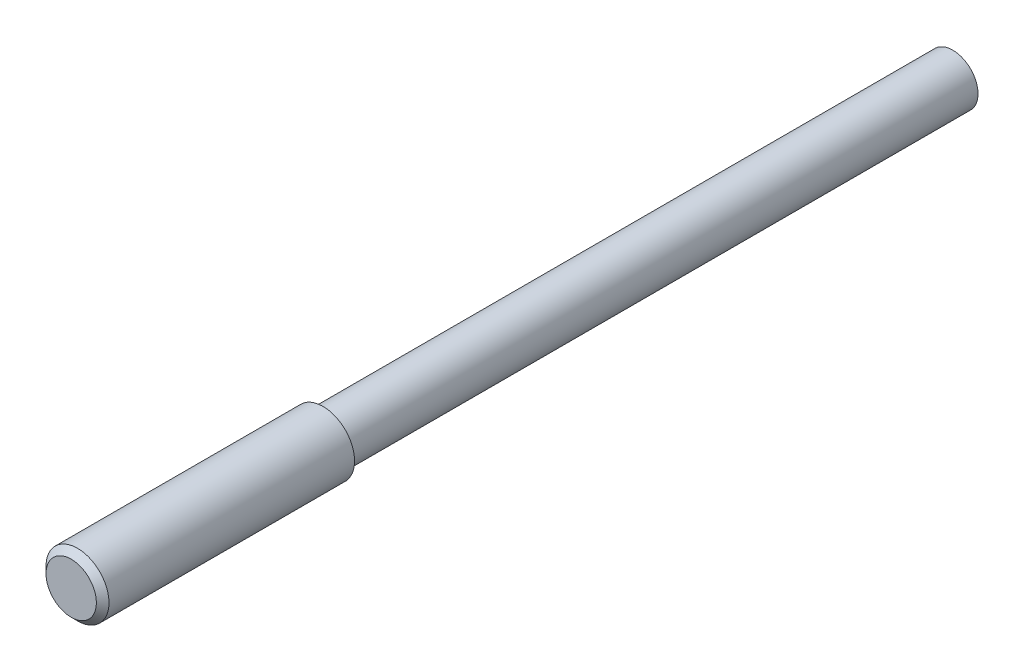
ISO-10303-21;
HEADER;
FILE_DESCRIPTION(('STEP AP214'),'2;1');
FILE_NAME('part.step','',(''),(''),'','','');
FILE_SCHEMA(('AUTOMOTIVE_DESIGN { 1 0 10303 214 1 1 1 1 }'));
ENDSEC;
DATA;
#1=APPLICATION_CONTEXT('core data for automotive mechanical design processes');
#2=APPLICATION_PROTOCOL_DEFINITION('international standard','automotive_design',2000,#1);
#3=PRODUCT_CONTEXT('',#1,'mechanical');
#4=PRODUCT('Part','Part','',(#3));
#5=PRODUCT_RELATED_PRODUCT_CATEGORY('part','',(#4));
#6=PRODUCT_DEFINITION_FORMATION('','',#4);
#7=PRODUCT_DEFINITION_CONTEXT('part definition',#1,'design');
#8=PRODUCT_DEFINITION('design','',#6,#7);
#9=PRODUCT_DEFINITION_SHAPE('','',#8);
#10=(LENGTH_UNIT() NAMED_UNIT(*) SI_UNIT(.MILLI.,.METRE.));
#11=(NAMED_UNIT(*) PLANE_ANGLE_UNIT() SI_UNIT($,.RADIAN.));
#12=(NAMED_UNIT(*) SI_UNIT($,.STERADIAN.) SOLID_ANGLE_UNIT());
#13=UNCERTAINTY_MEASURE_WITH_UNIT(LENGTH_MEASURE(1.E-05),#10,'distance_accuracy_value','');
#14=(GEOMETRIC_REPRESENTATION_CONTEXT(3) GLOBAL_UNCERTAINTY_ASSIGNED_CONTEXT((#13)) GLOBAL_UNIT_ASSIGNED_CONTEXT((#10,
#11,#12)) REPRESENTATION_CONTEXT('',''));
#15=CARTESIAN_POINT('',(0.,0.,0.));
#16=DIRECTION('',(0.,0.,1.));
#17=DIRECTION('',(1.,0.,0.));
#18=AXIS2_PLACEMENT_3D('',#15,#16,#17);
#19=CARTESIAN_POINT('',(9.50000000000009,0.,232.));
#20=DIRECTION('',(0.,0.,-1.));
#21=DIRECTION('',(-1.,0.,0.));
#22=AXIS2_PLACEMENT_3D('',#19,#20,#21);
#23=CYLINDRICAL_SURFACE('',#22,1.5);
#24=CARTESIAN_POINT('',(9.50000000000009,0.,231.7));
#25=DIRECTION('',(0.,0.,1.));
#26=DIRECTION('',(1.,0.,0.));
#27=AXIS2_PLACEMENT_3D('',#24,#25,#26);
#28=CIRCLE('',#27,1.5);
#29=CARTESIAN_POINT('',(11.0000000000001,0.,231.7));
#30=VERTEX_POINT('',#29);
#31=EDGE_CURVE('E10',#30,#30,#28,.F.);
#32=ORIENTED_EDGE('',*,*,#31,.T.);
#33=EDGE_LOOP('',(#32));
#34=FACE_BOUND('',#33,.T.);
#35=CARTESIAN_POINT('',(9.5,0.,220.));
#36=DIRECTION('',(0.,0.,1.));
#37=DIRECTION('',(1.,0.,0.));
#38=AXIS2_PLACEMENT_3D('',#35,#36,#37);
#39=CIRCLE('',#38,1.5);
#40=CARTESIAN_POINT('',(11.,0.,220.));
#41=VERTEX_POINT('',#40);
#42=EDGE_CURVE('E59',#41,#41,#39,.T.);
#43=ORIENTED_EDGE('',*,*,#42,.T.);
#44=EDGE_LOOP('',(#43));
#45=FACE_BOUND('',#44,.T.);
#46=ADVANCED_FACE('F43',(#34,#45),#23,.T.);
#47=CARTESIAN_POINT('',(9.50000000000009,0.,232.));
#48=DIRECTION('',(0.,0.,1.));
#49=DIRECTION('',(1.,0.,0.));
#50=AXIS2_PLACEMENT_3D('',#47,#48,#49);
#51=PLANE('',#50);
#52=CARTESIAN_POINT('',(9.50000000000009,0.,232.));
#53=DIRECTION('',(0.,0.,1.));
#54=DIRECTION('',(1.,0.,0.));
#55=AXIS2_PLACEMENT_3D('',#52,#53,#54);
#56=CIRCLE('',#55,1.20000000000001);
#57=CARTESIAN_POINT('',(10.7000000000001,0.,232.));
#58=VERTEX_POINT('',#57);
#59=EDGE_CURVE('E55',#58,#58,#56,.T.);
#60=ORIENTED_EDGE('',*,*,#59,.T.);
#61=EDGE_LOOP('',(#60));
#62=FACE_BOUND('',#61,.T.);
#63=ADVANCED_FACE('F86',(#62),#51,.T.);
#64=CARTESIAN_POINT('',(9.50000000000009,0.,232.));
#65=DIRECTION('',(0.,0.,-1.));
#66=DIRECTION('',(-1.,0.,0.));
#67=AXIS2_PLACEMENT_3D('',#64,#65,#66);
#68=CONICAL_SURFACE('',#67,1.20000000000001,0.785398163397441);
#69=ORIENTED_EDGE('',*,*,#31,.F.);
#70=EDGE_LOOP('',(#69));
#71=FACE_BOUND('',#70,.T.);
#72=ORIENTED_EDGE('',*,*,#59,.F.);
#73=EDGE_LOOP('',(#72));
#74=FACE_BOUND('',#73,.T.);
#75=ADVANCED_FACE('F46',(#71,#74),#68,.T.);
#76=CARTESIAN_POINT('',(9.5,0.,220.));
#77=DIRECTION('',(0.,0.,-1.));
#78=DIRECTION('',(-1.,0.,0.));
#79=AXIS2_PLACEMENT_3D('',#76,#77,#78);
#80=PLANE('',#79);
#81=CARTESIAN_POINT('',(9.5,0.,220.));
#82=DIRECTION('',(0.,0.,1.));
#83=DIRECTION('',(1.,0.,0.));
#84=AXIS2_PLACEMENT_3D('',#81,#82,#83);
#85=CIRCLE('',#84,1.2);
#86=CARTESIAN_POINT('',(10.7,0.,220.));
#87=VERTEX_POINT('',#86);
#88=EDGE_CURVE('E61',#87,#87,#85,.T.);
#89=ORIENTED_EDGE('',*,*,#88,.T.);
#90=EDGE_LOOP('',(#89));
#91=FACE_BOUND('',#90,.T.);
#92=ORIENTED_EDGE('',*,*,#42,.F.);
#93=EDGE_LOOP('',(#92));
#94=FACE_BOUND('',#93,.T.);
#95=ADVANCED_FACE('F71',(#91,#94),#80,.T.);
#96=CARTESIAN_POINT('',(9.5,0.,220.));
#97=DIRECTION('',(0.,0.,-1.));
#98=DIRECTION('',(-1.,0.,0.));
#99=AXIS2_PLACEMENT_3D('',#96,#97,#98);
#100=CYLINDRICAL_SURFACE('',#99,1.2);
#101=ORIENTED_EDGE('',*,*,#88,.F.);
#102=EDGE_LOOP('',(#101));
#103=FACE_BOUND('',#102,.T.);
#104=CARTESIAN_POINT('',(9.5,0.,190.));
#105=DIRECTION('',(0.,0.,1.));
#106=DIRECTION('',(1.,0.,0.));
#107=AXIS2_PLACEMENT_3D('',#104,#105,#106);
#108=CIRCLE('',#107,1.2);
#109=CARTESIAN_POINT('',(10.7,0.,190.));
#110=VERTEX_POINT('',#109);
#111=EDGE_CURVE('E70',#110,#110,#108,.T.);
#112=ORIENTED_EDGE('',*,*,#111,.T.);
#113=EDGE_LOOP('',(#112));
#114=FACE_BOUND('',#113,.T.);
#115=ADVANCED_FACE('F77',(#103,#114),#100,.T.);
#116=CARTESIAN_POINT('',(9.5,0.,190.));
#117=DIRECTION('',(0.,0.,1.));
#118=DIRECTION('',(1.,0.,0.));
#119=AXIS2_PLACEMENT_3D('',#116,#117,#118);
#120=PLANE('',#119);
#121=ORIENTED_EDGE('',*,*,#111,.F.);
#122=EDGE_LOOP('',(#121));
#123=FACE_BOUND('',#122,.T.);
#124=ADVANCED_FACE('F76',(#123),#120,.F.);
#125=CLOSED_SHELL('',(#46,#63,#75,#95,#115,#124));
#126=MANIFOLD_SOLID_BREP('B2',#125);
#127=ADVANCED_BREP_SHAPE_REPRESENTATION('',(#18,#126),#14);
#128=SHAPE_DEFINITION_REPRESENTATION(#9,#127);
ENDSEC;
END-ISO-10303-21;
